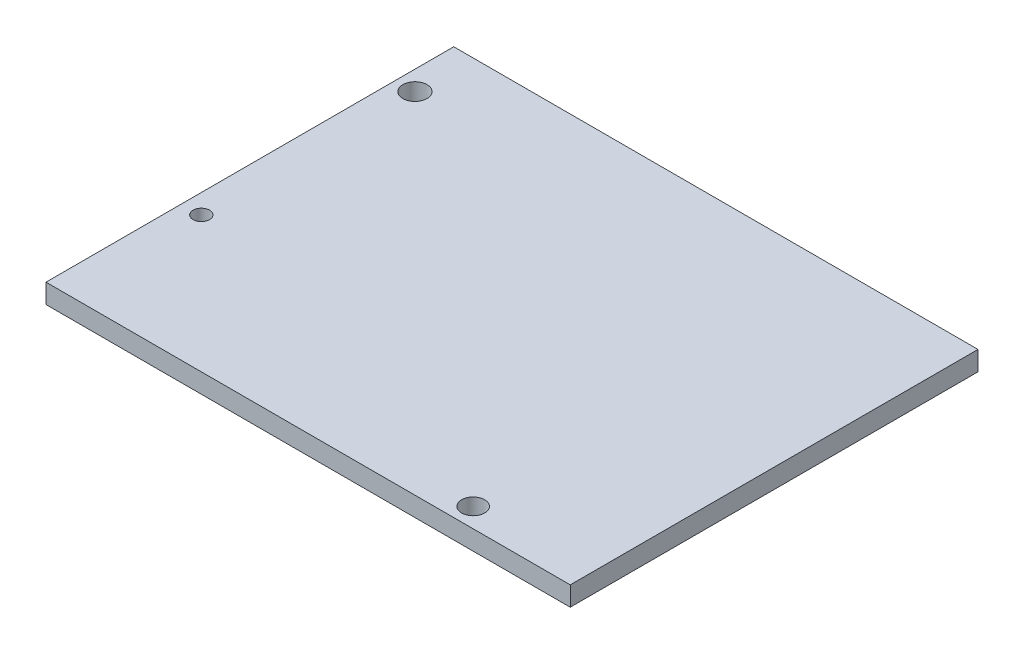
ISO-10303-21;
HEADER;
FILE_DESCRIPTION(('STEP AP214'),'2;1');
FILE_NAME('part.step','',(''),(''),'','','');
FILE_SCHEMA(('AUTOMOTIVE_DESIGN { 1 0 10303 214 1 1 1 1 }'));
ENDSEC;
DATA;
#1=APPLICATION_CONTEXT('core data for automotive mechanical design processes');
#2=APPLICATION_PROTOCOL_DEFINITION('international standard','automotive_design',2000,#1);
#3=PRODUCT_CONTEXT('',#1,'mechanical');
#4=PRODUCT('Part','Part','',(#3));
#5=PRODUCT_RELATED_PRODUCT_CATEGORY('part','',(#4));
#6=PRODUCT_DEFINITION_FORMATION('','',#4);
#7=PRODUCT_DEFINITION_CONTEXT('part definition',#1,'design');
#8=PRODUCT_DEFINITION('design','',#6,#7);
#9=PRODUCT_DEFINITION_SHAPE('','',#8);
#10=(LENGTH_UNIT() NAMED_UNIT(*) SI_UNIT(.MILLI.,.METRE.));
#11=(NAMED_UNIT(*) PLANE_ANGLE_UNIT() SI_UNIT($,.RADIAN.));
#12=(NAMED_UNIT(*) SI_UNIT($,.STERADIAN.) SOLID_ANGLE_UNIT());
#13=UNCERTAINTY_MEASURE_WITH_UNIT(LENGTH_MEASURE(1.E-05),#10,'distance_accuracy_value','');
#14=(GEOMETRIC_REPRESENTATION_CONTEXT(3) GLOBAL_UNCERTAINTY_ASSIGNED_CONTEXT((#13)) GLOBAL_UNIT_ASSIGNED_CONTEXT((#10,
#11,#12)) REPRESENTATION_CONTEXT('',''));
#15=CARTESIAN_POINT('',(0.,0.,0.));
#16=DIRECTION('',(0.,0.,1.));
#17=DIRECTION('',(1.,0.,0.));
#18=AXIS2_PLACEMENT_3D('',#15,#16,#17);
#19=CARTESIAN_POINT('',(2.26261760252872,2.54,43.8546875));
#20=DIRECTION('',(0.,1.,0.));
#21=DIRECTION('',(0.,0.,1.));
#22=AXIS2_PLACEMENT_3D('',#19,#20,#21);
#23=PLANE('',#22);
#24=CARTESIAN_POINT('',(55.6025668025287,2.54,41.3146875));
#25=DIRECTION('',(0.,1.,0.));
#26=DIRECTION('',(0.,0.,1.));
#27=AXIS2_PLACEMENT_3D('',#24,#25,#26);
#28=CIRCLE('',#27,1.50705100997178);
#29=CARTESIAN_POINT('',(55.6025668025287,2.54,42.8217385099718));
#30=VERTEX_POINT('',#29);
#31=EDGE_CURVE('E113',#30,#30,#28,.T.);
#32=ORIENTED_EDGE('',*,*,#31,.F.);
#33=EDGE_LOOP('',(#32));
#34=FACE_BOUND('',#33,.T.);
#35=DIRECTION('',(0.,0.,1.));
#36=VECTOR('',#35,1.);
#37=CARTESIAN_POINT('',(2.2626176025287,2.54,-9.48531250000001));
#38=LINE('',#37,#36);
#39=CARTESIAN_POINT('',(2.2626176025287,2.54,-9.48531250000001));
#40=VERTEX_POINT('',#39);
#41=CARTESIAN_POINT('',(2.26261760252872,2.54,43.8546875));
#42=VERTEX_POINT('',#41);
#43=EDGE_CURVE('E83',#40,#42,#38,.T.);
#44=ORIENTED_EDGE('',*,*,#43,.T.);
#45=DIRECTION('',(1.,0.,0.));
#46=VECTOR('',#45,1.);
#47=CARTESIAN_POINT('',(2.26261760252872,2.54,43.8546875));
#48=LINE('',#47,#46);
#49=CARTESIAN_POINT('',(70.8426176025287,2.54,43.8546875));
#50=VERTEX_POINT('',#49);
#51=EDGE_CURVE('E78',#42,#50,#48,.T.);
#52=ORIENTED_EDGE('',*,*,#51,.T.);
#53=DIRECTION('',(0.,0.,-1.));
#54=VECTOR('',#53,1.);
#55=CARTESIAN_POINT('',(70.8426176025287,2.54,-9.48531250000001));
#56=LINE('',#55,#54);
#57=CARTESIAN_POINT('',(70.8426176025287,2.54,-9.48531250000001));
#58=VERTEX_POINT('',#57);
#59=EDGE_CURVE('E81',#50,#58,#56,.T.);
#60=ORIENTED_EDGE('',*,*,#59,.T.);
#61=DIRECTION('',(-1.,0.,0.));
#62=VECTOR('',#61,1.);
#63=CARTESIAN_POINT('',(2.2626176025287,2.54,-9.48531250000001));
#64=LINE('',#63,#62);
#65=EDGE_CURVE('E48',#58,#40,#64,.T.);
#66=ORIENTED_EDGE('',*,*,#65,.T.);
#67=EDGE_LOOP('',(#44,#52,#60,#66));
#68=FACE_BOUND('',#67,.T.);
#69=CARTESIAN_POINT('',(4.80261760252871,2.54,-1.86531250000001));
#70=DIRECTION('',(0.,1.,0.));
#71=DIRECTION('',(0.,0.,1.));
#72=AXIS2_PLACEMENT_3D('',#69,#70,#71);
#73=CIRCLE('',#72,1.58353157950114);
#74=CARTESIAN_POINT('',(4.80261760252871,2.54,-0.281780920498869));
#75=VERTEX_POINT('',#74);
#76=EDGE_CURVE('E98',#75,#75,#73,.T.);
#77=ORIENTED_EDGE('',*,*,#76,.F.);
#78=EDGE_LOOP('',(#77));
#79=FACE_BOUND('',#78,.T.);
#80=CARTESIAN_POINT('',(4.80261760252871,2.54,26.0746875));
#81=DIRECTION('',(0.,1.,0.));
#82=DIRECTION('',(0.,0.,1.));
#83=AXIS2_PLACEMENT_3D('',#80,#81,#82);
#84=CIRCLE('',#83,1.0795);
#85=CARTESIAN_POINT('',(4.80261760252871,2.54,27.1541875));
#86=VERTEX_POINT('',#85);
#87=EDGE_CURVE('E119',#86,#86,#84,.T.);
#88=ORIENTED_EDGE('',*,*,#87,.F.);
#89=EDGE_LOOP('',(#88));
#90=FACE_BOUND('',#89,.T.);
#91=ADVANCED_FACE('F31',(#34,#68,#79,#90),#23,.T.);
#92=CARTESIAN_POINT('',(2.26261760252872,0.,43.8546875));
#93=DIRECTION('',(0.,1.,0.));
#94=DIRECTION('',(0.,0.,1.));
#95=AXIS2_PLACEMENT_3D('',#92,#93,#94);
#96=PLANE('',#95);
#97=CARTESIAN_POINT('',(55.6025668025287,0.,41.3146875));
#98=DIRECTION('',(0.,1.,0.));
#99=DIRECTION('',(0.,0.,1.));
#100=AXIS2_PLACEMENT_3D('',#97,#98,#99);
#101=CIRCLE('',#100,1.50705100997178);
#102=CARTESIAN_POINT('',(55.6025668025287,0.,42.8217385099718));
#103=VERTEX_POINT('',#102);
#104=EDGE_CURVE('E116',#103,#103,#101,.T.);
#105=ORIENTED_EDGE('',*,*,#104,.T.);
#106=EDGE_LOOP('',(#105));
#107=FACE_BOUND('',#106,.T.);
#108=DIRECTION('',(0.,0.,1.));
#109=VECTOR('',#108,1.);
#110=CARTESIAN_POINT('',(2.2626176025287,0.,-9.48531250000001));
#111=LINE('',#110,#109);
#112=CARTESIAN_POINT('',(2.2626176025287,0.,-9.48531250000001));
#113=VERTEX_POINT('',#112);
#114=CARTESIAN_POINT('',(2.26261760252872,0.,43.8546875));
#115=VERTEX_POINT('',#114);
#116=EDGE_CURVE('E95',#113,#115,#111,.T.);
#117=ORIENTED_EDGE('',*,*,#116,.F.);
#118=DIRECTION('',(-1.,0.,0.));
#119=VECTOR('',#118,1.);
#120=CARTESIAN_POINT('',(2.2626176025287,0.,-9.48531250000001));
#121=LINE('',#120,#119);
#122=CARTESIAN_POINT('',(70.8426176025287,0.,-9.48531250000001));
#123=VERTEX_POINT('',#122);
#124=EDGE_CURVE('E71',#123,#113,#121,.T.);
#125=ORIENTED_EDGE('',*,*,#124,.F.);
#126=DIRECTION('',(0.,0.,-1.));
#127=VECTOR('',#126,1.);
#128=CARTESIAN_POINT('',(70.8426176025287,0.,-9.48531250000001));
#129=LINE('',#128,#127);
#130=CARTESIAN_POINT('',(70.8426176025287,0.,43.8546875));
#131=VERTEX_POINT('',#130);
#132=EDGE_CURVE('E65',#131,#123,#129,.T.);
#133=ORIENTED_EDGE('',*,*,#132,.F.);
#134=DIRECTION('',(1.,0.,0.));
#135=VECTOR('',#134,1.);
#136=CARTESIAN_POINT('',(2.26261760252872,0.,43.8546875));
#137=LINE('',#136,#135);
#138=EDGE_CURVE('E87',#115,#131,#137,.T.);
#139=ORIENTED_EDGE('',*,*,#138,.F.);
#140=EDGE_LOOP('',(#117,#125,#133,#139));
#141=FACE_BOUND('',#140,.T.);
#142=CARTESIAN_POINT('',(4.80261760252871,0.,-1.86531250000001));
#143=DIRECTION('',(0.,1.,0.));
#144=DIRECTION('',(0.,0.,1.));
#145=AXIS2_PLACEMENT_3D('',#142,#143,#144);
#146=CIRCLE('',#145,1.58353157950114);
#147=CARTESIAN_POINT('',(4.80261760252871,0.,-0.281780920498869));
#148=VERTEX_POINT('',#147);
#149=EDGE_CURVE('E110',#148,#148,#146,.T.);
#150=ORIENTED_EDGE('',*,*,#149,.T.);
#151=EDGE_LOOP('',(#150));
#152=FACE_BOUND('',#151,.T.);
#153=CARTESIAN_POINT('',(4.80261760252871,0.,26.0746875));
#154=DIRECTION('',(0.,1.,0.));
#155=DIRECTION('',(0.,0.,1.));
#156=AXIS2_PLACEMENT_3D('',#153,#154,#155);
#157=CIRCLE('',#156,1.0795);
#158=CARTESIAN_POINT('',(4.80261760252871,0.,27.1541875));
#159=VERTEX_POINT('',#158);
#160=EDGE_CURVE('E122',#159,#159,#157,.T.);
#161=ORIENTED_EDGE('',*,*,#160,.T.);
#162=EDGE_LOOP('',(#161));
#163=FACE_BOUND('',#162,.T.);
#164=ADVANCED_FACE('F106',(#107,#141,#152,#163),#96,.F.);
#165=CARTESIAN_POINT('',(2.2626176025287,2.54,-9.48531250000001));
#166=DIRECTION('',(1.,0.,0.));
#167=DIRECTION('',(0.,0.,-1.));
#168=AXIS2_PLACEMENT_3D('',#165,#166,#167);
#169=PLANE('',#168);
#170=ORIENTED_EDGE('',*,*,#116,.T.);
#171=DIRECTION('',(0.,-1.,0.));
#172=VECTOR('',#171,1.);
#173=CARTESIAN_POINT('',(2.26261760252872,2.54,43.8546875));
#174=LINE('',#173,#172);
#175=EDGE_CURVE('E11',#42,#115,#174,.T.);
#176=ORIENTED_EDGE('',*,*,#175,.F.);
#177=ORIENTED_EDGE('',*,*,#43,.F.);
#178=DIRECTION('',(0.,-1.,0.));
#179=VECTOR('',#178,1.);
#180=CARTESIAN_POINT('',(2.2626176025287,2.54,-9.48531250000001));
#181=LINE('',#180,#179);
#182=EDGE_CURVE('E91',#40,#113,#181,.T.);
#183=ORIENTED_EDGE('',*,*,#182,.T.);
#184=EDGE_LOOP('',(#170,#176,#177,#183));
#185=FACE_BOUND('',#184,.T.);
#186=ADVANCED_FACE('F33',(#185),#169,.F.);
#187=CARTESIAN_POINT('',(2.26261760252872,2.54,43.8546875));
#188=DIRECTION('',(0.,0.,-1.));
#189=DIRECTION('',(-1.,0.,0.));
#190=AXIS2_PLACEMENT_3D('',#187,#188,#189);
#191=PLANE('',#190);
#192=ORIENTED_EDGE('',*,*,#138,.T.);
#193=DIRECTION('',(0.,-1.,0.));
#194=VECTOR('',#193,1.);
#195=CARTESIAN_POINT('',(70.8426176025287,2.54,43.8546875));
#196=LINE('',#195,#194);
#197=EDGE_CURVE('E40',#50,#131,#196,.T.);
#198=ORIENTED_EDGE('',*,*,#197,.F.);
#199=ORIENTED_EDGE('',*,*,#51,.F.);
#200=ORIENTED_EDGE('',*,*,#175,.T.);
#201=EDGE_LOOP('',(#192,#198,#199,#200));
#202=FACE_BOUND('',#201,.T.);
#203=ADVANCED_FACE('F86',(#202),#191,.F.);
#204=CARTESIAN_POINT('',(70.8426176025287,2.54,-9.48531250000001));
#205=DIRECTION('',(-1.,0.,0.));
#206=DIRECTION('',(0.,0.,1.));
#207=AXIS2_PLACEMENT_3D('',#204,#205,#206);
#208=PLANE('',#207);
#209=ORIENTED_EDGE('',*,*,#132,.T.);
#210=DIRECTION('',(0.,-1.,0.));
#211=VECTOR('',#210,1.);
#212=CARTESIAN_POINT('',(70.8426176025287,2.54,-9.48531250000001));
#213=LINE('',#212,#211);
#214=EDGE_CURVE('E88',#58,#123,#213,.T.);
#215=ORIENTED_EDGE('',*,*,#214,.F.);
#216=ORIENTED_EDGE('',*,*,#59,.F.);
#217=ORIENTED_EDGE('',*,*,#197,.T.);
#218=EDGE_LOOP('',(#209,#215,#216,#217));
#219=FACE_BOUND('',#218,.T.);
#220=ADVANCED_FACE('F89',(#219),#208,.F.);
#221=CARTESIAN_POINT('',(2.2626176025287,2.54,-9.48531250000001));
#222=DIRECTION('',(0.,0.,1.));
#223=DIRECTION('',(1.,0.,0.));
#224=AXIS2_PLACEMENT_3D('',#221,#222,#223);
#225=PLANE('',#224);
#226=ORIENTED_EDGE('',*,*,#124,.T.);
#227=ORIENTED_EDGE('',*,*,#182,.F.);
#228=ORIENTED_EDGE('',*,*,#65,.F.);
#229=ORIENTED_EDGE('',*,*,#214,.T.);
#230=EDGE_LOOP('',(#226,#227,#228,#229));
#231=FACE_BOUND('',#230,.T.);
#232=ADVANCED_FACE('F103',(#231),#225,.F.);
#233=CARTESIAN_POINT('',(4.80261760252871,2.54,-1.86531250000001));
#234=DIRECTION('',(0.,-1.,0.));
#235=DIRECTION('',(0.,0.,-1.));
#236=AXIS2_PLACEMENT_3D('',#233,#234,#235);
#237=CYLINDRICAL_SURFACE('',#236,1.58353157950114);
#238=ORIENTED_EDGE('',*,*,#76,.T.);
#239=EDGE_LOOP('',(#238));
#240=FACE_BOUND('',#239,.T.);
#241=ORIENTED_EDGE('',*,*,#149,.F.);
#242=EDGE_LOOP('',(#241));
#243=FACE_BOUND('',#242,.T.);
#244=ADVANCED_FACE('F141',(#240,#243),#237,.F.);
#245=CARTESIAN_POINT('',(55.6025668025287,2.54,41.3146875));
#246=DIRECTION('',(0.,-1.,0.));
#247=DIRECTION('',(0.,0.,-1.));
#248=AXIS2_PLACEMENT_3D('',#245,#246,#247);
#249=CYLINDRICAL_SURFACE('',#248,1.50705100997178);
#250=ORIENTED_EDGE('',*,*,#31,.T.);
#251=EDGE_LOOP('',(#250));
#252=FACE_BOUND('',#251,.T.);
#253=ORIENTED_EDGE('',*,*,#104,.F.);
#254=EDGE_LOOP('',(#253));
#255=FACE_BOUND('',#254,.T.);
#256=ADVANCED_FACE('F187',(#252,#255),#249,.F.);
#257=CARTESIAN_POINT('',(4.80261760252871,2.54,26.0746875));
#258=DIRECTION('',(0.,-1.,0.));
#259=DIRECTION('',(0.,0.,-1.));
#260=AXIS2_PLACEMENT_3D('',#257,#258,#259);
#261=CYLINDRICAL_SURFACE('',#260,1.0795);
#262=ORIENTED_EDGE('',*,*,#87,.T.);
#263=EDGE_LOOP('',(#262));
#264=FACE_BOUND('',#263,.T.);
#265=ORIENTED_EDGE('',*,*,#160,.F.);
#266=EDGE_LOOP('',(#265));
#267=FACE_BOUND('',#266,.T.);
#268=ADVANCED_FACE('F128',(#264,#267),#261,.F.);
#269=CLOSED_SHELL('',(#91,#164,#186,#203,#220,#232,#244,#256,#268));
#270=MANIFOLD_SOLID_BREP('B2',#269);
#271=ADVANCED_BREP_SHAPE_REPRESENTATION('',(#18,#270),#14);
#272=SHAPE_DEFINITION_REPRESENTATION(#9,#271);
ENDSEC;
END-ISO-10303-21;
